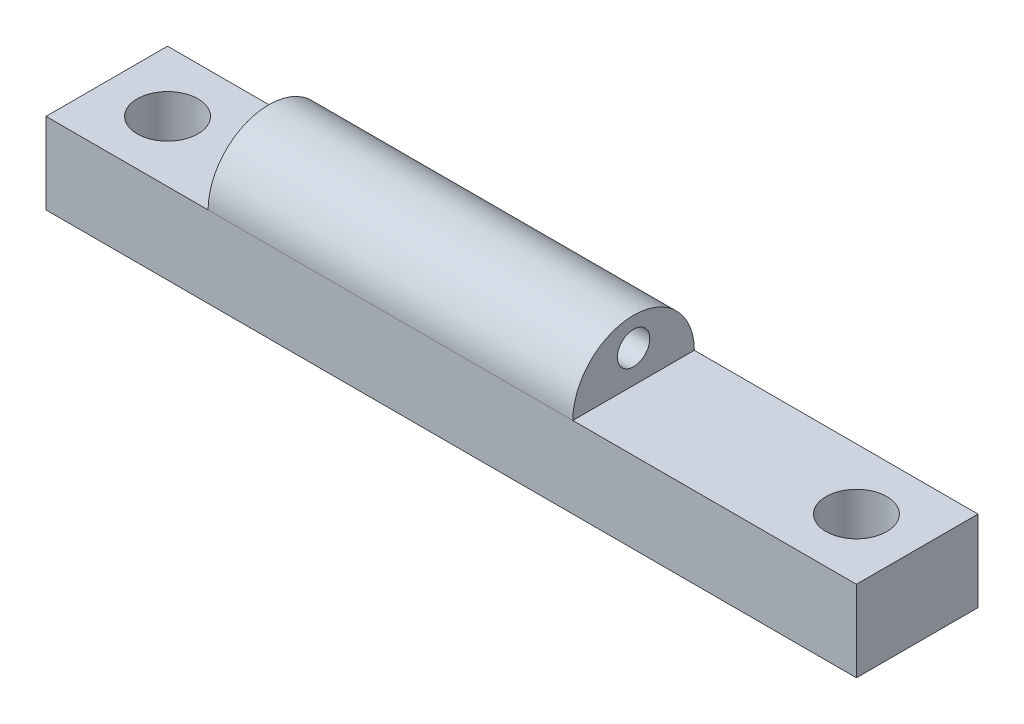
ISO-10303-21;
HEADER;
FILE_DESCRIPTION(('STEP AP214'),'2;1');
FILE_NAME('part.step','',(''),(''),'','','');
FILE_SCHEMA(('AUTOMOTIVE_DESIGN { 1 0 10303 214 1 1 1 1 }'));
ENDSEC;
DATA;
#1=APPLICATION_CONTEXT('core data for automotive mechanical design processes');
#2=APPLICATION_PROTOCOL_DEFINITION('international standard','automotive_design',2000,#1);
#3=PRODUCT_CONTEXT('',#1,'mechanical');
#4=PRODUCT('Part','Part','',(#3));
#5=PRODUCT_RELATED_PRODUCT_CATEGORY('part','',(#4));
#6=PRODUCT_DEFINITION_FORMATION('','',#4);
#7=PRODUCT_DEFINITION_CONTEXT('part definition',#1,'design');
#8=PRODUCT_DEFINITION('design','',#6,#7);
#9=PRODUCT_DEFINITION_SHAPE('','',#8);
#10=(LENGTH_UNIT() NAMED_UNIT(*) SI_UNIT(.MILLI.,.METRE.));
#11=(NAMED_UNIT(*) PLANE_ANGLE_UNIT() SI_UNIT($,.RADIAN.));
#12=(NAMED_UNIT(*) SI_UNIT($,.STERADIAN.) SOLID_ANGLE_UNIT());
#13=UNCERTAINTY_MEASURE_WITH_UNIT(LENGTH_MEASURE(1.E-05),#10,'distance_accuracy_value','');
#14=(GEOMETRIC_REPRESENTATION_CONTEXT(3) GLOBAL_UNCERTAINTY_ASSIGNED_CONTEXT((#13)) GLOBAL_UNIT_ASSIGNED_CONTEXT((#10,
#11,#12)) REPRESENTATION_CONTEXT('',''));
#15=CARTESIAN_POINT('',(0.,0.,0.));
#16=DIRECTION('',(0.,0.,1.));
#17=DIRECTION('',(1.,0.,0.));
#18=AXIS2_PLACEMENT_3D('',#15,#16,#17);
#19=CARTESIAN_POINT('',(-15.24,5.08,0.));
#20=DIRECTION('',(1.,0.,0.));
#21=DIRECTION('',(0.,0.,-1.));
#22=AXIS2_PLACEMENT_3D('',#19,#20,#21);
#23=CYLINDRICAL_SURFACE('',#22,3.81);
#24=CARTESIAN_POINT('',(7.61999999999999,5.08,0.));
#25=DIRECTION('',(1.,0.,0.));
#26=DIRECTION('',(0.,0.,1.));
#27=AXIS2_PLACEMENT_3D('',#24,#25,#26);
#28=CIRCLE('',#27,3.81);
#29=CARTESIAN_POINT('',(7.61999999999999,5.08,-3.81000000000001));
#30=VERTEX_POINT('',#29);
#31=CARTESIAN_POINT('',(7.61999999999999,5.08,3.80999999999999));
#32=VERTEX_POINT('',#31);
#33=EDGE_CURVE('E77',#30,#32,#28,.T.);
#34=ORIENTED_EDGE('',*,*,#33,.F.);
#35=DIRECTION('',(1.,0.,0.));
#36=VECTOR('',#35,1.);
#37=CARTESIAN_POINT('',(-15.24,5.08,-3.81000000000002));
#38=LINE('',#37,#36);
#39=CARTESIAN_POINT('',(-15.24,5.08,-3.81000000000002));
#40=VERTEX_POINT('',#39);
#41=EDGE_CURVE('E12',#40,#30,#38,.T.);
#42=ORIENTED_EDGE('',*,*,#41,.F.);
#43=CARTESIAN_POINT('',(-15.24,5.08,0.));
#44=DIRECTION('',(1.,0.,0.));
#45=DIRECTION('',(0.,0.,1.));
#46=AXIS2_PLACEMENT_3D('',#43,#44,#45);
#47=CIRCLE('',#46,3.81);
#48=CARTESIAN_POINT('',(-15.24,5.08,3.80999999999998));
#49=VERTEX_POINT('',#48);
#50=EDGE_CURVE('E82',#40,#49,#47,.T.);
#51=ORIENTED_EDGE('',*,*,#50,.T.);
#52=DIRECTION('',(1.,0.,0.));
#53=VECTOR('',#52,1.);
#54=CARTESIAN_POINT('',(-15.24,5.08,3.80999999999998));
#55=LINE('',#54,#53);
#56=EDGE_CURVE('E51',#49,#32,#55,.T.);
#57=ORIENTED_EDGE('',*,*,#56,.T.);
#58=EDGE_LOOP('',(#34,#42,#51,#57));
#59=FACE_BOUND('',#58,.T.);
#60=ADVANCED_FACE('F48',(#59),#23,.T.);
#61=CARTESIAN_POINT('',(-15.24,5.08,-3.81000000000002));
#62=DIRECTION('',(0.,-1.,0.));
#63=DIRECTION('',(0.,0.,-1.));
#64=AXIS2_PLACEMENT_3D('',#61,#62,#63);
#65=PLANE('',#64);
#66=DIRECTION('',(0.,0.,-1.));
#67=VECTOR('',#66,1.);
#68=CARTESIAN_POINT('',(7.61999999999999,5.08,-3.81000000000001));
#69=LINE('',#68,#67);
#70=EDGE_CURVE('E74',#32,#30,#69,.T.);
#71=ORIENTED_EDGE('',*,*,#70,.F.);
#72=ORIENTED_EDGE('',*,*,#56,.F.);
#73=DIRECTION('',(0.,0.,-1.));
#74=VECTOR('',#73,1.);
#75=CARTESIAN_POINT('',(-15.24,5.08,-3.81000000000002));
#76=LINE('',#75,#74);
#77=EDGE_CURVE('E76',#49,#40,#76,.T.);
#78=ORIENTED_EDGE('',*,*,#77,.T.);
#79=ORIENTED_EDGE('',*,*,#41,.T.);
#80=EDGE_LOOP('',(#71,#72,#78,#79));
#81=FACE_BOUND('',#80,.T.);
#82=ADVANCED_FACE('F72',(#81),#65,.T.);
#83=CARTESIAN_POINT('',(-15.24,5.08,0.));
#84=DIRECTION('',(-1.,0.,0.));
#85=DIRECTION('',(0.,0.,1.));
#86=AXIS2_PLACEMENT_3D('',#83,#84,#85);
#87=PLANE('',#86);
#88=CARTESIAN_POINT('',(-15.24,7.112,0.));
#89=DIRECTION('',(1.,0.,0.));
#90=DIRECTION('',(0.,0.,-1.));
#91=AXIS2_PLACEMENT_3D('',#88,#89,#90);
#92=CIRCLE('',#91,1.016);
#93=CARTESIAN_POINT('',(-15.24,7.112,-1.01600000000002));
#94=VERTEX_POINT('',#93);
#95=EDGE_CURVE('E79',#94,#94,#92,.T.);
#96=ORIENTED_EDGE('',*,*,#95,.T.);
#97=EDGE_LOOP('',(#96));
#98=FACE_BOUND('',#97,.T.);
#99=ORIENTED_EDGE('',*,*,#50,.F.);
#100=ORIENTED_EDGE('',*,*,#77,.F.);
#101=EDGE_LOOP('',(#99,#100));
#102=FACE_BOUND('',#101,.T.);
#103=ADVANCED_FACE('F93',(#98,#102),#87,.T.);
#104=CARTESIAN_POINT('',(7.61999999999999,5.08,0.));
#105=DIRECTION('',(-1.,0.,0.));
#106=DIRECTION('',(0.,0.,1.));
#107=AXIS2_PLACEMENT_3D('',#104,#105,#106);
#108=PLANE('',#107);
#109=CARTESIAN_POINT('',(7.61999999999999,7.112,0.));
#110=DIRECTION('',(1.,0.,0.));
#111=DIRECTION('',(0.,0.,-1.));
#112=AXIS2_PLACEMENT_3D('',#109,#110,#111);
#113=CIRCLE('',#112,1.016);
#114=CARTESIAN_POINT('',(7.61999999999999,7.112,-1.01600000000001));
#115=VERTEX_POINT('',#114);
#116=EDGE_CURVE('E87',#115,#115,#113,.T.);
#117=ORIENTED_EDGE('',*,*,#116,.F.);
#118=EDGE_LOOP('',(#117));
#119=FACE_BOUND('',#118,.T.);
#120=ORIENTED_EDGE('',*,*,#33,.T.);
#121=ORIENTED_EDGE('',*,*,#70,.T.);
#122=EDGE_LOOP('',(#120,#121));
#123=FACE_BOUND('',#122,.T.);
#124=ADVANCED_FACE('F81',(#119,#123),#108,.F.);
#125=CARTESIAN_POINT('',(-15.24,7.112,0.));
#126=DIRECTION('',(1.,0.,0.));
#127=DIRECTION('',(0.,0.,-1.));
#128=AXIS2_PLACEMENT_3D('',#125,#126,#127);
#129=CYLINDRICAL_SURFACE('',#128,1.016);
#130=ORIENTED_EDGE('',*,*,#95,.F.);
#131=EDGE_LOOP('',(#130));
#132=FACE_BOUND('',#131,.T.);
#133=ORIENTED_EDGE('',*,*,#116,.T.);
#134=EDGE_LOOP('',(#133));
#135=FACE_BOUND('',#134,.T.);
#136=ADVANCED_FACE('F96',(#132,#135),#129,.F.);
#137=CLOSED_SHELL('',(#60,#82,#103,#124,#136));
#138=MANIFOLD_SOLID_BREP('B2',#137);
#139=CARTESIAN_POINT('',(25.4,5.08,-3.81));
#140=DIRECTION('',(-1.,0.,0.));
#141=DIRECTION('',(0.,0.,1.));
#142=AXIS2_PLACEMENT_3D('',#139,#140,#141);
#143=PLANE('',#142);
#144=DIRECTION('',(0.,0.,-1.));
#145=VECTOR('',#144,1.);
#146=CARTESIAN_POINT('',(25.4,0.,-3.81));
#147=LINE('',#146,#145);
#148=CARTESIAN_POINT('',(25.4,0.,3.81));
#149=VERTEX_POINT('',#148);
#150=CARTESIAN_POINT('',(25.4,0.,-3.81));
#151=VERTEX_POINT('',#150);
#152=EDGE_CURVE('E208',#149,#151,#147,.T.);
#153=ORIENTED_EDGE('',*,*,#152,.T.);
#154=DIRECTION('',(0.,-1.,0.));
#155=VECTOR('',#154,1.);
#156=CARTESIAN_POINT('',(25.4,5.08,-3.81));
#157=LINE('',#156,#155);
#158=CARTESIAN_POINT('',(25.4,5.08,-3.81));
#159=VERTEX_POINT('',#158);
#160=EDGE_CURVE('E46',#159,#151,#157,.T.);
#161=ORIENTED_EDGE('',*,*,#160,.F.);
#162=DIRECTION('',(0.,0.,-1.));
#163=VECTOR('',#162,1.);
#164=CARTESIAN_POINT('',(25.4,5.08,-3.81));
#165=LINE('',#164,#163);
#166=CARTESIAN_POINT('',(25.4,5.08,3.81));
#167=VERTEX_POINT('',#166);
#168=EDGE_CURVE('E192',#167,#159,#165,.T.);
#169=ORIENTED_EDGE('',*,*,#168,.F.);
#170=DIRECTION('',(0.,-1.,0.));
#171=VECTOR('',#170,1.);
#172=CARTESIAN_POINT('',(25.4,5.08,3.81));
#173=LINE('',#172,#171);
#174=EDGE_CURVE('E204',#167,#149,#173,.T.);
#175=ORIENTED_EDGE('',*,*,#174,.T.);
#176=EDGE_LOOP('',(#153,#161,#169,#175));
#177=FACE_BOUND('',#176,.T.);
#178=ADVANCED_FACE('F140',(#177),#143,.F.);
#179=CARTESIAN_POINT('',(-25.4,5.08,-3.81));
#180=DIRECTION('',(0.,0.,1.));
#181=DIRECTION('',(1.,0.,0.));
#182=AXIS2_PLACEMENT_3D('',#179,#180,#181);
#183=PLANE('',#182);
#184=DIRECTION('',(-1.,0.,0.));
#185=VECTOR('',#184,1.);
#186=CARTESIAN_POINT('',(-25.4,0.,-3.81));
#187=LINE('',#186,#185);
#188=CARTESIAN_POINT('',(-25.4,0.,-3.81));
#189=VERTEX_POINT('',#188);
#190=EDGE_CURVE('E197',#151,#189,#187,.T.);
#191=ORIENTED_EDGE('',*,*,#190,.T.);
#192=DIRECTION('',(0.,-1.,0.));
#193=VECTOR('',#192,1.);
#194=CARTESIAN_POINT('',(-25.4,5.08,-3.81));
#195=LINE('',#194,#193);
#196=CARTESIAN_POINT('',(-25.4,5.08,-3.81));
#197=VERTEX_POINT('',#196);
#198=EDGE_CURVE('E149',#197,#189,#195,.T.);
#199=ORIENTED_EDGE('',*,*,#198,.F.);
#200=DIRECTION('',(-1.,0.,0.));
#201=VECTOR('',#200,1.);
#202=CARTESIAN_POINT('',(-25.4,5.08,-3.81));
#203=LINE('',#202,#201);
#204=EDGE_CURVE('E187',#159,#197,#203,.T.);
#205=ORIENTED_EDGE('',*,*,#204,.F.);
#206=ORIENTED_EDGE('',*,*,#160,.T.);
#207=EDGE_LOOP('',(#191,#199,#205,#206));
#208=FACE_BOUND('',#207,.T.);
#209=ADVANCED_FACE('F196',(#208),#183,.F.);
#210=CARTESIAN_POINT('',(-25.4,5.08,-3.81));
#211=DIRECTION('',(1.,0.,0.));
#212=DIRECTION('',(0.,0.,-1.));
#213=AXIS2_PLACEMENT_3D('',#210,#211,#212);
#214=PLANE('',#213);
#215=DIRECTION('',(0.,0.,1.));
#216=VECTOR('',#215,1.);
#217=CARTESIAN_POINT('',(-25.4,0.,-3.81));
#218=LINE('',#217,#216);
#219=CARTESIAN_POINT('',(-25.4,0.,3.81));
#220=VERTEX_POINT('',#219);
#221=EDGE_CURVE('E174',#189,#220,#218,.T.);
#222=ORIENTED_EDGE('',*,*,#221,.T.);
#223=DIRECTION('',(0.,-1.,0.));
#224=VECTOR('',#223,1.);
#225=CARTESIAN_POINT('',(-25.4,5.08,3.81));
#226=LINE('',#225,#224);
#227=CARTESIAN_POINT('',(-25.4,5.08,3.81));
#228=VERTEX_POINT('',#227);
#229=EDGE_CURVE('E199',#228,#220,#226,.T.);
#230=ORIENTED_EDGE('',*,*,#229,.F.);
#231=DIRECTION('',(0.,0.,1.));
#232=VECTOR('',#231,1.);
#233=CARTESIAN_POINT('',(-25.4,5.08,-3.81));
#234=LINE('',#233,#232);
#235=EDGE_CURVE('E190',#197,#228,#234,.T.);
#236=ORIENTED_EDGE('',*,*,#235,.F.);
#237=ORIENTED_EDGE('',*,*,#198,.T.);
#238=EDGE_LOOP('',(#222,#230,#236,#237));
#239=FACE_BOUND('',#238,.T.);
#240=ADVANCED_FACE('F200',(#239),#214,.F.);
#241=CARTESIAN_POINT('',(-25.4,5.08,3.81));
#242=DIRECTION('',(0.,0.,-1.));
#243=DIRECTION('',(-1.,0.,0.));
#244=AXIS2_PLACEMENT_3D('',#241,#242,#243);
#245=PLANE('',#244);
#246=DIRECTION('',(1.,0.,0.));
#247=VECTOR('',#246,1.);
#248=CARTESIAN_POINT('',(-25.4,0.,3.81));
#249=LINE('',#248,#247);
#250=EDGE_CURVE('E180',#220,#149,#249,.T.);
#251=ORIENTED_EDGE('',*,*,#250,.T.);
#252=ORIENTED_EDGE('',*,*,#174,.F.);
#253=DIRECTION('',(1.,0.,0.));
#254=VECTOR('',#253,1.);
#255=CARTESIAN_POINT('',(-25.4,5.08,3.81));
#256=LINE('',#255,#254);
#257=EDGE_CURVE('E157',#228,#167,#256,.T.);
#258=ORIENTED_EDGE('',*,*,#257,.F.);
#259=ORIENTED_EDGE('',*,*,#229,.T.);
#260=EDGE_LOOP('',(#251,#252,#258,#259));
#261=FACE_BOUND('',#260,.T.);
#262=ADVANCED_FACE('F222',(#261),#245,.F.);
#263=CARTESIAN_POINT('',(0.,5.08,0.));
#264=DIRECTION('',(0.,1.,0.));
#265=DIRECTION('',(0.,0.,1.));
#266=AXIS2_PLACEMENT_3D('',#263,#264,#265);
#267=PLANE('',#266);
#268=CARTESIAN_POINT('',(-21.59,5.08,0.));
#269=DIRECTION('',(0.,1.,0.));
#270=DIRECTION('',(0.,0.,1.));
#271=AXIS2_PLACEMENT_3D('',#268,#269,#270);
#272=CIRCLE('',#271,1.905);
#273=CARTESIAN_POINT('',(-21.59,5.08,1.905));
#274=VERTEX_POINT('',#273);
#275=EDGE_CURVE('E237',#274,#274,#272,.T.);
#276=ORIENTED_EDGE('',*,*,#275,.F.);
#277=EDGE_LOOP('',(#276));
#278=FACE_BOUND('',#277,.T.);
#279=CARTESIAN_POINT('',(21.59,5.08,0.));
#280=DIRECTION('',(0.,1.,0.));
#281=DIRECTION('',(0.,0.,1.));
#282=AXIS2_PLACEMENT_3D('',#279,#280,#281);
#283=CIRCLE('',#282,1.905);
#284=CARTESIAN_POINT('',(21.59,5.08,1.905));
#285=VERTEX_POINT('',#284);
#286=EDGE_CURVE('E229',#285,#285,#283,.T.);
#287=ORIENTED_EDGE('',*,*,#286,.F.);
#288=EDGE_LOOP('',(#287));
#289=FACE_BOUND('',#288,.T.);
#290=ORIENTED_EDGE('',*,*,#168,.T.);
#291=ORIENTED_EDGE('',*,*,#204,.T.);
#292=ORIENTED_EDGE('',*,*,#235,.T.);
#293=ORIENTED_EDGE('',*,*,#257,.T.);
#294=EDGE_LOOP('',(#290,#291,#292,#293));
#295=FACE_BOUND('',#294,.T.);
#296=ADVANCED_FACE('F188',(#278,#289,#295),#267,.T.);
#297=CARTESIAN_POINT('',(0.,0.,0.));
#298=DIRECTION('',(0.,1.,0.));
#299=DIRECTION('',(0.,0.,1.));
#300=AXIS2_PLACEMENT_3D('',#297,#298,#299);
#301=PLANE('',#300);
#302=CARTESIAN_POINT('',(-21.59,0.,0.));
#303=DIRECTION('',(0.,1.,0.));
#304=DIRECTION('',(0.,0.,1.));
#305=AXIS2_PLACEMENT_3D('',#302,#303,#304);
#306=CIRCLE('',#305,1.905);
#307=CARTESIAN_POINT('',(-21.59,0.,1.905));
#308=VERTEX_POINT('',#307);
#309=EDGE_CURVE('E212',#308,#308,#306,.T.);
#310=ORIENTED_EDGE('',*,*,#309,.T.);
#311=EDGE_LOOP('',(#310));
#312=FACE_BOUND('',#311,.T.);
#313=CARTESIAN_POINT('',(21.59,0.,0.));
#314=DIRECTION('',(0.,1.,0.));
#315=DIRECTION('',(0.,0.,1.));
#316=AXIS2_PLACEMENT_3D('',#313,#314,#315);
#317=CIRCLE('',#316,1.905);
#318=CARTESIAN_POINT('',(21.59,0.,1.905));
#319=VERTEX_POINT('',#318);
#320=EDGE_CURVE('E233',#319,#319,#317,.T.);
#321=ORIENTED_EDGE('',*,*,#320,.T.);
#322=EDGE_LOOP('',(#321));
#323=FACE_BOUND('',#322,.T.);
#324=ORIENTED_EDGE('',*,*,#152,.F.);
#325=ORIENTED_EDGE('',*,*,#250,.F.);
#326=ORIENTED_EDGE('',*,*,#221,.F.);
#327=ORIENTED_EDGE('',*,*,#190,.F.);
#328=EDGE_LOOP('',(#324,#325,#326,#327));
#329=FACE_BOUND('',#328,.T.);
#330=ADVANCED_FACE('F225',(#312,#323,#329),#301,.F.);
#331=CARTESIAN_POINT('',(21.59,0.,0.));
#332=DIRECTION('',(0.,1.,0.));
#333=DIRECTION('',(0.,0.,1.));
#334=AXIS2_PLACEMENT_3D('',#331,#332,#333);
#335=CYLINDRICAL_SURFACE('',#334,1.905);
#336=ORIENTED_EDGE('',*,*,#320,.F.);
#337=EDGE_LOOP('',(#336));
#338=FACE_BOUND('',#337,.T.);
#339=ORIENTED_EDGE('',*,*,#286,.T.);
#340=EDGE_LOOP('',(#339));
#341=FACE_BOUND('',#340,.T.);
#342=ADVANCED_FACE('F250',(#338,#341),#335,.F.);
#343=CARTESIAN_POINT('',(-21.59,0.,0.));
#344=DIRECTION('',(0.,1.,0.));
#345=DIRECTION('',(0.,0.,1.));
#346=AXIS2_PLACEMENT_3D('',#343,#344,#345);
#347=CYLINDRICAL_SURFACE('',#346,1.905);
#348=ORIENTED_EDGE('',*,*,#309,.F.);
#349=EDGE_LOOP('',(#348));
#350=FACE_BOUND('',#349,.T.);
#351=ORIENTED_EDGE('',*,*,#275,.T.);
#352=EDGE_LOOP('',(#351));
#353=FACE_BOUND('',#352,.T.);
#354=ADVANCED_FACE('F247',(#350,#353),#347,.F.);
#355=CLOSED_SHELL('',(#178,#209,#240,#262,#296,#330,#342,#354));
#356=MANIFOLD_SOLID_BREP('B6',#355);
#357=ADVANCED_BREP_SHAPE_REPRESENTATION('',(#18,#138,#356),#14);
#358=SHAPE_DEFINITION_REPRESENTATION(#9,#357);
ENDSEC;
END-ISO-10303-21;
